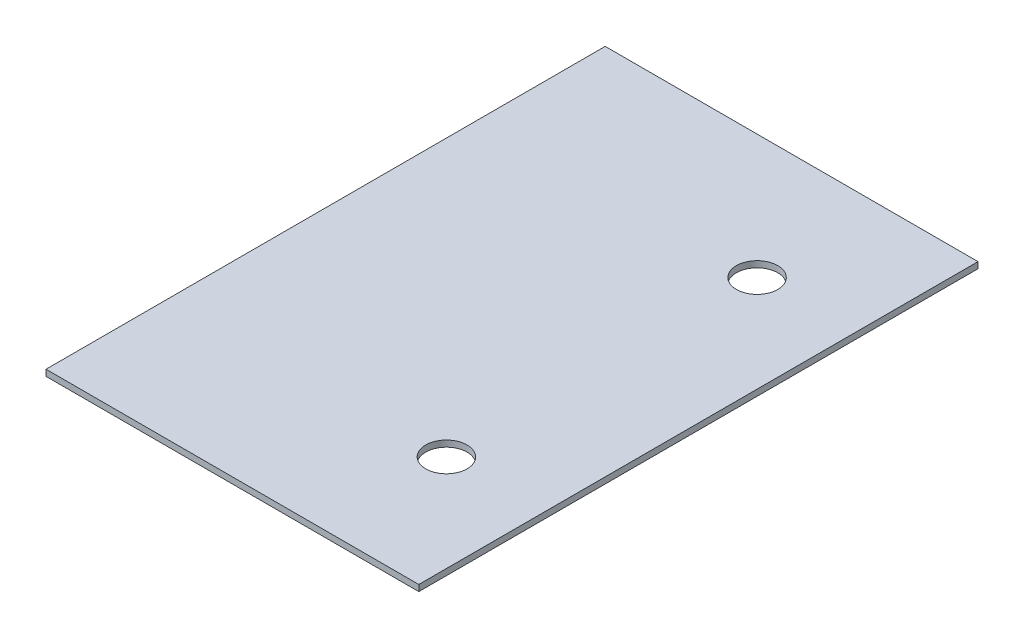
ISO-10303-21;
HEADER;
FILE_DESCRIPTION(('STEP AP214'),'2;1');
FILE_NAME('part.step','',(''),(''),'','','');
FILE_SCHEMA(('AUTOMOTIVE_DESIGN { 1 0 10303 214 1 1 1 1 }'));
ENDSEC;
DATA;
#1=APPLICATION_CONTEXT('core data for automotive mechanical design processes');
#2=APPLICATION_PROTOCOL_DEFINITION('international standard','automotive_design',2000,#1);
#3=PRODUCT_CONTEXT('',#1,'mechanical');
#4=PRODUCT('Part','Part','',(#3));
#5=PRODUCT_RELATED_PRODUCT_CATEGORY('part','',(#4));
#6=PRODUCT_DEFINITION_FORMATION('','',#4);
#7=PRODUCT_DEFINITION_CONTEXT('part definition',#1,'design');
#8=PRODUCT_DEFINITION('design','',#6,#7);
#9=PRODUCT_DEFINITION_SHAPE('','',#8);
#10=(LENGTH_UNIT() NAMED_UNIT(*) SI_UNIT(.MILLI.,.METRE.));
#11=(NAMED_UNIT(*) PLANE_ANGLE_UNIT() SI_UNIT($,.RADIAN.));
#12=(NAMED_UNIT(*) SI_UNIT($,.STERADIAN.) SOLID_ANGLE_UNIT());
#13=UNCERTAINTY_MEASURE_WITH_UNIT(LENGTH_MEASURE(1.E-05),#10,'distance_accuracy_value','');
#14=(GEOMETRIC_REPRESENTATION_CONTEXT(3) GLOBAL_UNCERTAINTY_ASSIGNED_CONTEXT((#13)) GLOBAL_UNIT_ASSIGNED_CONTEXT((#10,
#11,#12)) REPRESENTATION_CONTEXT('',''));
#15=CARTESIAN_POINT('',(0.,0.,0.));
#16=DIRECTION('',(0.,0.,1.));
#17=DIRECTION('',(1.,0.,0.));
#18=AXIS2_PLACEMENT_3D('',#15,#16,#17);
#19=CARTESIAN_POINT('',(15.,0.5,-22.5));
#20=DIRECTION('',(-1.,0.,0.));
#21=DIRECTION('',(0.,0.,1.));
#22=AXIS2_PLACEMENT_3D('',#19,#20,#21);
#23=PLANE('',#22);
#24=DIRECTION('',(0.,0.,-1.));
#25=VECTOR('',#24,1.);
#26=CARTESIAN_POINT('',(15.,0.,-22.5));
#27=LINE('',#26,#25);
#28=CARTESIAN_POINT('',(15.,0.,22.5));
#29=VERTEX_POINT('',#28);
#30=CARTESIAN_POINT('',(15.,0.,-22.5));
#31=VERTEX_POINT('',#30);
#32=EDGE_CURVE('E111',#29,#31,#27,.T.);
#33=ORIENTED_EDGE('',*,*,#32,.T.);
#34=DIRECTION('',(0.,-1.,0.));
#35=VECTOR('',#34,1.);
#36=CARTESIAN_POINT('',(15.,0.5,-22.5));
#37=LINE('',#36,#35);
#38=CARTESIAN_POINT('',(15.,0.5,-22.5));
#39=VERTEX_POINT('',#38);
#40=EDGE_CURVE('E11',#39,#31,#37,.T.);
#41=ORIENTED_EDGE('',*,*,#40,.F.);
#42=DIRECTION('',(0.,0.,-1.));
#43=VECTOR('',#42,1.);
#44=CARTESIAN_POINT('',(15.,0.5,-22.5));
#45=LINE('',#44,#43);
#46=CARTESIAN_POINT('',(15.,0.5,22.5));
#47=VERTEX_POINT('',#46);
#48=EDGE_CURVE('E94',#47,#39,#45,.T.);
#49=ORIENTED_EDGE('',*,*,#48,.F.);
#50=DIRECTION('',(0.,-1.,0.));
#51=VECTOR('',#50,1.);
#52=CARTESIAN_POINT('',(15.,0.5,22.5));
#53=LINE('',#52,#51);
#54=EDGE_CURVE('E107',#47,#29,#53,.T.);
#55=ORIENTED_EDGE('',*,*,#54,.T.);
#56=EDGE_LOOP('',(#33,#41,#49,#55));
#57=FACE_BOUND('',#56,.T.);
#58=ADVANCED_FACE('F41',(#57),#23,.F.);
#59=CARTESIAN_POINT('',(-15.,0.5,-22.5));
#60=DIRECTION('',(0.,0.,1.));
#61=DIRECTION('',(1.,0.,0.));
#62=AXIS2_PLACEMENT_3D('',#59,#60,#61);
#63=PLANE('',#62);
#64=DIRECTION('',(-1.,0.,0.));
#65=VECTOR('',#64,1.);
#66=CARTESIAN_POINT('',(-15.,0.,-22.5));
#67=LINE('',#66,#65);
#68=CARTESIAN_POINT('',(-15.,0.,-22.5));
#69=VERTEX_POINT('',#68);
#70=EDGE_CURVE('E99',#31,#69,#67,.T.);
#71=ORIENTED_EDGE('',*,*,#70,.T.);
#72=DIRECTION('',(0.,-1.,0.));
#73=VECTOR('',#72,1.);
#74=CARTESIAN_POINT('',(-15.,0.5,-22.5));
#75=LINE('',#74,#73);
#76=CARTESIAN_POINT('',(-15.,0.5,-22.5));
#77=VERTEX_POINT('',#76);
#78=EDGE_CURVE('E49',#77,#69,#75,.T.);
#79=ORIENTED_EDGE('',*,*,#78,.F.);
#80=DIRECTION('',(-1.,0.,0.));
#81=VECTOR('',#80,1.);
#82=CARTESIAN_POINT('',(-15.,0.5,-22.5));
#83=LINE('',#82,#81);
#84=EDGE_CURVE('E89',#39,#77,#83,.T.);
#85=ORIENTED_EDGE('',*,*,#84,.F.);
#86=ORIENTED_EDGE('',*,*,#40,.T.);
#87=EDGE_LOOP('',(#71,#79,#85,#86));
#88=FACE_BOUND('',#87,.T.);
#89=ADVANCED_FACE('F98',(#88),#63,.F.);
#90=CARTESIAN_POINT('',(-15.,0.5,-22.5));
#91=DIRECTION('',(1.,0.,0.));
#92=DIRECTION('',(0.,0.,-1.));
#93=AXIS2_PLACEMENT_3D('',#90,#91,#92);
#94=PLANE('',#93);
#95=DIRECTION('',(0.,0.,1.));
#96=VECTOR('',#95,1.);
#97=CARTESIAN_POINT('',(-15.,0.,-22.5));
#98=LINE('',#97,#96);
#99=CARTESIAN_POINT('',(-15.,0.,22.5));
#100=VERTEX_POINT('',#99);
#101=EDGE_CURVE('E76',#69,#100,#98,.T.);
#102=ORIENTED_EDGE('',*,*,#101,.T.);
#103=DIRECTION('',(0.,-1.,0.));
#104=VECTOR('',#103,1.);
#105=CARTESIAN_POINT('',(-15.,0.5,22.5));
#106=LINE('',#105,#104);
#107=CARTESIAN_POINT('',(-15.,0.5,22.5));
#108=VERTEX_POINT('',#107);
#109=EDGE_CURVE('E100',#108,#100,#106,.T.);
#110=ORIENTED_EDGE('',*,*,#109,.F.);
#111=DIRECTION('',(0.,0.,1.));
#112=VECTOR('',#111,1.);
#113=CARTESIAN_POINT('',(-15.,0.5,-22.5));
#114=LINE('',#113,#112);
#115=EDGE_CURVE('E92',#77,#108,#114,.T.);
#116=ORIENTED_EDGE('',*,*,#115,.F.);
#117=ORIENTED_EDGE('',*,*,#78,.T.);
#118=EDGE_LOOP('',(#102,#110,#116,#117));
#119=FACE_BOUND('',#118,.T.);
#120=ADVANCED_FACE('F101',(#119),#94,.F.);
#121=CARTESIAN_POINT('',(-15.,0.5,22.5));
#122=DIRECTION('',(0.,0.,-1.));
#123=DIRECTION('',(-1.,0.,0.));
#124=AXIS2_PLACEMENT_3D('',#121,#122,#123);
#125=PLANE('',#124);
#126=DIRECTION('',(1.,0.,0.));
#127=VECTOR('',#126,1.);
#128=CARTESIAN_POINT('',(-15.,0.,22.5));
#129=LINE('',#128,#127);
#130=EDGE_CURVE('E82',#100,#29,#129,.T.);
#131=ORIENTED_EDGE('',*,*,#130,.T.);
#132=ORIENTED_EDGE('',*,*,#54,.F.);
#133=DIRECTION('',(1.,0.,0.));
#134=VECTOR('',#133,1.);
#135=CARTESIAN_POINT('',(-15.,0.5,22.5));
#136=LINE('',#135,#134);
#137=EDGE_CURVE('E57',#108,#47,#136,.T.);
#138=ORIENTED_EDGE('',*,*,#137,.F.);
#139=ORIENTED_EDGE('',*,*,#109,.T.);
#140=EDGE_LOOP('',(#131,#132,#138,#139));
#141=FACE_BOUND('',#140,.T.);
#142=ADVANCED_FACE('F121',(#141),#125,.F.);
#143=CARTESIAN_POINT('',(0.,0.5,0.));
#144=DIRECTION('',(0.,1.,0.));
#145=DIRECTION('',(0.,0.,1.));
#146=AXIS2_PLACEMENT_3D('',#143,#144,#145);
#147=PLANE('',#146);
#148=CARTESIAN_POINT('',(7.22138086569772,0.5,-12.5));
#149=DIRECTION('',(0.,1.,0.));
#150=DIRECTION('',(0.,0.,1.));
#151=AXIS2_PLACEMENT_3D('',#148,#149,#150);
#152=CIRCLE('',#151,1.665);
#153=CARTESIAN_POINT('',(7.22138086569772,0.5,-10.835));
#154=VERTEX_POINT('',#153);
#155=EDGE_CURVE('E130',#154,#154,#152,.T.);
#156=ORIENTED_EDGE('',*,*,#155,.F.);
#157=EDGE_LOOP('',(#156));
#158=FACE_BOUND('',#157,.T.);
#159=CARTESIAN_POINT('',(7.22138086569768,0.5,12.5));
#160=DIRECTION('',(0.,1.,0.));
#161=DIRECTION('',(0.,0.,1.));
#162=AXIS2_PLACEMENT_3D('',#159,#160,#161);
#163=CIRCLE('',#162,1.665);
#164=CARTESIAN_POINT('',(7.22138086569768,0.5,14.165));
#165=VERTEX_POINT('',#164);
#166=EDGE_CURVE('E131',#165,#165,#163,.T.);
#167=ORIENTED_EDGE('',*,*,#166,.F.);
#168=EDGE_LOOP('',(#167));
#169=FACE_BOUND('',#168,.T.);
#170=ORIENTED_EDGE('',*,*,#48,.T.);
#171=ORIENTED_EDGE('',*,*,#84,.T.);
#172=ORIENTED_EDGE('',*,*,#115,.T.);
#173=ORIENTED_EDGE('',*,*,#137,.T.);
#174=EDGE_LOOP('',(#170,#171,#172,#173));
#175=FACE_BOUND('',#174,.T.);
#176=ADVANCED_FACE('F90',(#158,#169,#175),#147,.T.);
#177=CARTESIAN_POINT('',(0.,0.,0.));
#178=DIRECTION('',(0.,1.,0.));
#179=DIRECTION('',(0.,0.,1.));
#180=AXIS2_PLACEMENT_3D('',#177,#178,#179);
#181=PLANE('',#180);
#182=CARTESIAN_POINT('',(7.22138086569772,0.,-12.5));
#183=DIRECTION('',(0.,1.,0.));
#184=DIRECTION('',(0.,0.,1.));
#185=AXIS2_PLACEMENT_3D('',#182,#183,#184);
#186=CIRCLE('',#185,1.665);
#187=CARTESIAN_POINT('',(7.22138086569772,0.,-10.835));
#188=VERTEX_POINT('',#187);
#189=EDGE_CURVE('E114',#188,#188,#186,.F.);
#190=ORIENTED_EDGE('',*,*,#189,.F.);
#191=EDGE_LOOP('',(#190));
#192=FACE_BOUND('',#191,.T.);
#193=CARTESIAN_POINT('',(7.22138086569768,0.,12.5));
#194=DIRECTION('',(0.,1.,0.));
#195=DIRECTION('',(0.,0.,1.));
#196=AXIS2_PLACEMENT_3D('',#193,#194,#195);
#197=CIRCLE('',#196,1.665);
#198=CARTESIAN_POINT('',(7.22138086569768,0.,14.165));
#199=VERTEX_POINT('',#198);
#200=EDGE_CURVE('E127',#199,#199,#197,.F.);
#201=ORIENTED_EDGE('',*,*,#200,.F.);
#202=EDGE_LOOP('',(#201));
#203=FACE_BOUND('',#202,.T.);
#204=ORIENTED_EDGE('',*,*,#32,.F.);
#205=ORIENTED_EDGE('',*,*,#130,.F.);
#206=ORIENTED_EDGE('',*,*,#101,.F.);
#207=ORIENTED_EDGE('',*,*,#70,.F.);
#208=EDGE_LOOP('',(#204,#205,#206,#207));
#209=FACE_BOUND('',#208,.T.);
#210=ADVANCED_FACE('F124',(#192,#203,#209),#181,.F.);
#211=CARTESIAN_POINT('',(7.22138086569768,-0.00100000000000002,12.5));
#212=DIRECTION('',(0.,1.,0.));
#213=DIRECTION('',(0.,0.,1.));
#214=AXIS2_PLACEMENT_3D('',#211,#212,#213);
#215=CYLINDRICAL_SURFACE('',#214,1.665);
#216=ORIENTED_EDGE('',*,*,#166,.T.);
#217=EDGE_LOOP('',(#216));
#218=FACE_BOUND('',#217,.T.);
#219=ORIENTED_EDGE('',*,*,#200,.T.);
#220=EDGE_LOOP('',(#219));
#221=FACE_BOUND('',#220,.T.);
#222=ADVANCED_FACE('F147',(#218,#221),#215,.F.);
#223=CARTESIAN_POINT('',(7.22138086569772,-0.00100000000000002,-12.5));
#224=DIRECTION('',(0.,1.,0.));
#225=DIRECTION('',(0.,0.,1.));
#226=AXIS2_PLACEMENT_3D('',#223,#224,#225);
#227=CYLINDRICAL_SURFACE('',#226,1.665);
#228=ORIENTED_EDGE('',*,*,#155,.T.);
#229=EDGE_LOOP('',(#228));
#230=FACE_BOUND('',#229,.T.);
#231=ORIENTED_EDGE('',*,*,#189,.T.);
#232=EDGE_LOOP('',(#231));
#233=FACE_BOUND('',#232,.T.);
#234=ADVANCED_FACE('F139',(#230,#233),#227,.F.);
#235=CLOSED_SHELL('',(#58,#89,#120,#142,#176,#210,#222,#234));
#236=MANIFOLD_SOLID_BREP('B2',#235);
#237=ADVANCED_BREP_SHAPE_REPRESENTATION('',(#18,#236),#14);
#238=SHAPE_DEFINITION_REPRESENTATION(#9,#237);
ENDSEC;
END-ISO-10303-21;
